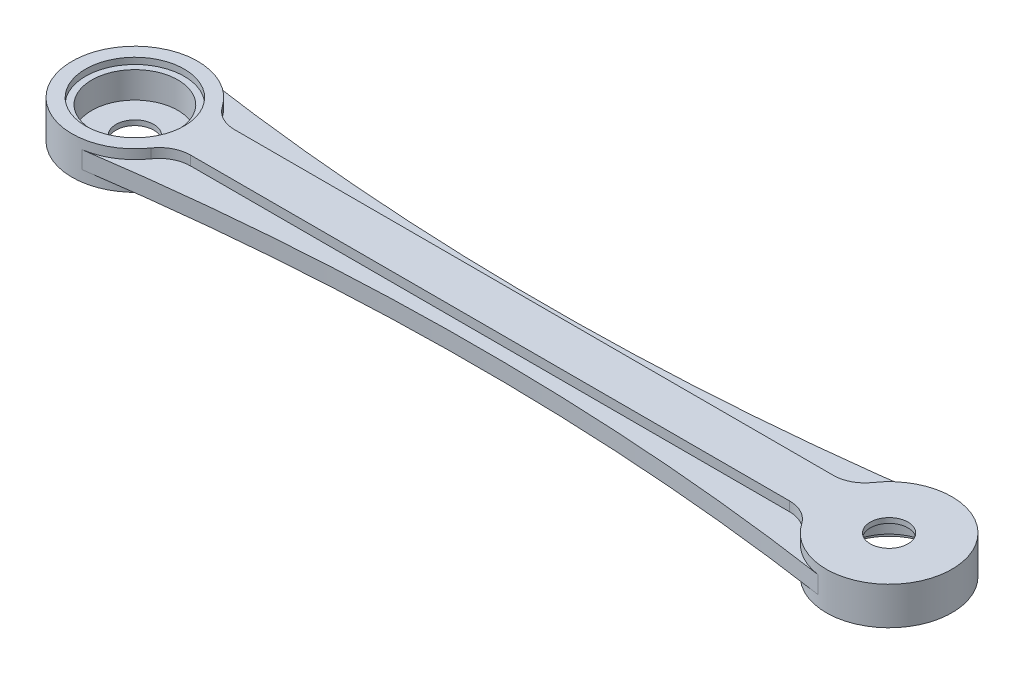
ISO-10303-21;
HEADER;
FILE_DESCRIPTION(('STEP AP214'),'2;1');
FILE_NAME('part.step','',(''),(''),'','','');
FILE_SCHEMA(('AUTOMOTIVE_DESIGN { 1 0 10303 214 1 1 1 1 }'));
ENDSEC;
DATA;
#1=APPLICATION_CONTEXT('core data for automotive mechanical design processes');
#2=APPLICATION_PROTOCOL_DEFINITION('international standard','automotive_design',2000,#1);
#3=PRODUCT_CONTEXT('',#1,'mechanical');
#4=PRODUCT('Part','Part','',(#3));
#5=PRODUCT_RELATED_PRODUCT_CATEGORY('part','',(#4));
#6=PRODUCT_DEFINITION_FORMATION('','',#4);
#7=PRODUCT_DEFINITION_CONTEXT('part definition',#1,'design');
#8=PRODUCT_DEFINITION('design','',#6,#7);
#9=PRODUCT_DEFINITION_SHAPE('','',#8);
#10=(LENGTH_UNIT() NAMED_UNIT(*) SI_UNIT(.MILLI.,.METRE.));
#11=(NAMED_UNIT(*) PLANE_ANGLE_UNIT() SI_UNIT($,.RADIAN.));
#12=(NAMED_UNIT(*) SI_UNIT($,.STERADIAN.) SOLID_ANGLE_UNIT());
#13=UNCERTAINTY_MEASURE_WITH_UNIT(LENGTH_MEASURE(1.E-05),#10,'distance_accuracy_value','');
#14=(GEOMETRIC_REPRESENTATION_CONTEXT(3) GLOBAL_UNCERTAINTY_ASSIGNED_CONTEXT((#13)) GLOBAL_UNIT_ASSIGNED_CONTEXT((#10,
#11,#12)) REPRESENTATION_CONTEXT('',''));
#15=CARTESIAN_POINT('',(0.,0.,0.));
#16=DIRECTION('',(0.,0.,1.));
#17=DIRECTION('',(1.,0.,0.));
#18=AXIS2_PLACEMENT_3D('',#15,#16,#17);
#19=CARTESIAN_POINT('',(-60.,6.,405.585995813465));
#20=DIRECTION('',(0.,-1.,0.));
#21=DIRECTION('',(0.,0.,-1.));
#22=AXIS2_PLACEMENT_3D('',#19,#20,#21);
#23=CYLINDRICAL_SURFACE('',#22,400.);
#24=CARTESIAN_POINT('',(-60.,1.75,405.585995813465));
#25=DIRECTION('',(0.,-1.,0.));
#26=DIRECTION('',(0.,0.,-1.));
#27=AXIS2_PLACEMENT_3D('',#24,#25,#26);
#28=CIRCLE('',#27,400.);
#29=CARTESIAN_POINT('',(-118.536585365854,1.75,9.89234136130402));
#30=VERTEX_POINT('',#29);
#31=CARTESIAN_POINT('',(-1.46341463414641,1.75,9.89234136130401));
#32=VERTEX_POINT('',#31);
#33=EDGE_CURVE('E189',#30,#32,#28,.T.);
#34=ORIENTED_EDGE('',*,*,#33,.T.);
#35=DIRECTION('',(0.,-1.,0.));
#36=VECTOR('',#35,1.);
#37=CARTESIAN_POINT('',(-1.46341463414634,6.,9.89234136130402));
#38=LINE('',#37,#36);
#39=CARTESIAN_POINT('',(-1.46341463414635,4.5,9.89234136130402));
#40=VERTEX_POINT('',#39);
#41=EDGE_CURVE('E49',#40,#32,#38,.T.);
#42=ORIENTED_EDGE('',*,*,#41,.F.);
#43=CARTESIAN_POINT('',(-60.,4.5,405.585995813465));
#44=DIRECTION('',(0.,1.,0.));
#45=DIRECTION('',(0.,0.,1.));
#46=AXIS2_PLACEMENT_3D('',#43,#44,#45);
#47=CIRCLE('',#46,400.);
#48=CARTESIAN_POINT('',(-118.536585365854,4.5,9.89234136130407));
#49=VERTEX_POINT('',#48);
#50=EDGE_CURVE('E204',#49,#40,#47,.F.);
#51=ORIENTED_EDGE('',*,*,#50,.F.);
#52=DIRECTION('',(0.,-1.,0.));
#53=VECTOR('',#52,1.);
#54=CARTESIAN_POINT('',(-118.536585365854,6.,9.89234136130402));
#55=LINE('',#54,#53);
#56=EDGE_CURVE('E11',#49,#30,#55,.T.);
#57=ORIENTED_EDGE('',*,*,#56,.T.);
#58=EDGE_LOOP('',(#34,#42,#51,#57));
#59=FACE_BOUND('',#58,.T.);
#60=ADVANCED_FACE('F39',(#59),#23,.F.);
#61=CARTESIAN_POINT('',(-60.,6.,-405.585995813465));
#62=DIRECTION('',(0.,-1.,0.));
#63=DIRECTION('',(0.,0.,-1.));
#64=AXIS2_PLACEMENT_3D('',#61,#62,#63);
#65=CYLINDRICAL_SURFACE('',#64,400.);
#66=DIRECTION('',(0.,-1.,0.));
#67=VECTOR('',#66,1.);
#68=CARTESIAN_POINT('',(-1.46341463414634,6.,-9.89234136130402));
#69=LINE('',#68,#67);
#70=CARTESIAN_POINT('',(-1.46341463414613,4.5,-9.89234136130407));
#71=VERTEX_POINT('',#70);
#72=CARTESIAN_POINT('',(-1.46341463414634,1.75,-9.89234136130402));
#73=VERTEX_POINT('',#72);
#74=EDGE_CURVE('E360',#71,#73,#69,.T.);
#75=ORIENTED_EDGE('',*,*,#74,.T.);
#76=CARTESIAN_POINT('',(-60.,1.75,-405.585995813465));
#77=DIRECTION('',(0.,-1.,0.));
#78=DIRECTION('',(0.,0.,-1.));
#79=AXIS2_PLACEMENT_3D('',#76,#77,#78);
#80=CIRCLE('',#79,400.);
#81=CARTESIAN_POINT('',(-118.536585365854,1.75,-9.89234136130404));
#82=VERTEX_POINT('',#81);
#83=EDGE_CURVE('E480',#73,#82,#80,.T.);
#84=ORIENTED_EDGE('',*,*,#83,.T.);
#85=DIRECTION('',(0.,-1.,0.));
#86=VECTOR('',#85,1.);
#87=CARTESIAN_POINT('',(-118.536585365854,6.,-9.89234136130402));
#88=LINE('',#87,#86);
#89=CARTESIAN_POINT('',(-118.536585365854,4.5,-9.89234136130407));
#90=VERTEX_POINT('',#89);
#91=EDGE_CURVE('E348',#90,#82,#88,.T.);
#92=ORIENTED_EDGE('',*,*,#91,.F.);
#93=CARTESIAN_POINT('',(-60.,4.5,-405.585995813465));
#94=DIRECTION('',(0.,1.,0.));
#95=DIRECTION('',(0.,0.,1.));
#96=AXIS2_PLACEMENT_3D('',#93,#94,#95);
#97=CIRCLE('',#96,400.);
#98=EDGE_CURVE('E418',#71,#90,#97,.F.);
#99=ORIENTED_EDGE('',*,*,#98,.F.);
#100=EDGE_LOOP('',(#75,#84,#92,#99));
#101=FACE_BOUND('',#100,.T.);
#102=ADVANCED_FACE('F400',(#101),#65,.F.);
#103=CARTESIAN_POINT('',(0.,6.,0.));
#104=DIRECTION('',(0.,1.,0.));
#105=DIRECTION('',(0.,0.,1.));
#106=AXIS2_PLACEMENT_3D('',#103,#104,#105);
#107=PLANE('',#106);
#108=CARTESIAN_POINT('',(-120.,6.,0.));
#109=DIRECTION('',(0.,1.,0.));
#110=DIRECTION('',(0.,0.,1.));
#111=AXIS2_PLACEMENT_3D('',#108,#109,#110);
#112=CIRCLE('',#111,7.84999999999999);
#113=CARTESIAN_POINT('',(-120.,6.,7.84999999999999));
#114=VERTEX_POINT('',#113);
#115=EDGE_CURVE('E335',#114,#114,#112,.T.);
#116=ORIENTED_EDGE('',*,*,#115,.F.);
#117=EDGE_LOOP('',(#116));
#118=FACE_BOUND('',#117,.T.);
#119=CARTESIAN_POINT('',(0.,6.,0.));
#120=DIRECTION('',(0.,1.,0.));
#121=DIRECTION('',(0.,0.,1.));
#122=AXIS2_PLACEMENT_3D('',#119,#120,#121);
#123=CIRCLE('',#122,3.);
#124=CARTESIAN_POINT('',(0.,6.,3.));
#125=VERTEX_POINT('',#124);
#126=EDGE_CURVE('E344',#125,#125,#123,.T.);
#127=ORIENTED_EDGE('',*,*,#126,.F.);
#128=EDGE_LOOP('',(#127));
#129=FACE_BOUND('',#128,.T.);
#130=CARTESIAN_POINT('',(-107.640792905692,6.,-8.5));
#131=DIRECTION('',(0.,1.,0.));
#132=DIRECTION('',(0.,0.,1.));
#133=AXIS2_PLACEMENT_3D('',#130,#131,#132);
#134=CIRCLE('',#133,5.);
#135=CARTESIAN_POINT('',(-111.760528603794,6.,-5.66666666666667));
#136=VERTEX_POINT('',#135);
#137=CARTESIAN_POINT('',(-107.640792905692,6.,-3.5));
#138=VERTEX_POINT('',#137);
#139=EDGE_CURVE('E244',#136,#138,#134,.T.);
#140=ORIENTED_EDGE('',*,*,#139,.F.);
#141=CARTESIAN_POINT('',(-120.,6.,0.));
#142=DIRECTION('',(0.,1.,0.));
#143=DIRECTION('',(0.,0.,1.));
#144=AXIS2_PLACEMENT_3D('',#141,#142,#143);
#145=CIRCLE('',#144,9.99999999999999);
#146=CARTESIAN_POINT('',(-111.760528603794,6.,5.66666666666667));
#147=VERTEX_POINT('',#146);
#148=EDGE_CURVE('E57',#136,#147,#145,.T.);
#149=ORIENTED_EDGE('',*,*,#148,.T.);
#150=CARTESIAN_POINT('',(-107.640792905692,6.,8.5));
#151=DIRECTION('',(0.,1.,0.));
#152=DIRECTION('',(0.,0.,1.));
#153=AXIS2_PLACEMENT_3D('',#150,#151,#152);
#154=CIRCLE('',#153,5.);
#155=CARTESIAN_POINT('',(-107.640792905692,6.,3.5));
#156=VERTEX_POINT('',#155);
#157=EDGE_CURVE('E215',#156,#147,#154,.T.);
#158=ORIENTED_EDGE('',*,*,#157,.F.);
#159=DIRECTION('',(1.,0.,0.));
#160=VECTOR('',#159,1.);
#161=CARTESIAN_POINT('',(0.,6.,3.5));
#162=LINE('',#161,#160);
#163=CARTESIAN_POINT('',(-12.3592070943083,6.,3.5));
#164=VERTEX_POINT('',#163);
#165=EDGE_CURVE('E234',#156,#164,#162,.T.);
#166=ORIENTED_EDGE('',*,*,#165,.T.);
#167=CARTESIAN_POINT('',(-12.3592070943083,6.,8.5));
#168=DIRECTION('',(0.,1.,0.));
#169=DIRECTION('',(0.,0.,1.));
#170=AXIS2_PLACEMENT_3D('',#167,#168,#169);
#171=CIRCLE('',#170,5.);
#172=CARTESIAN_POINT('',(-8.23947139620552,6.,5.66666666666666));
#173=VERTEX_POINT('',#172);
#174=EDGE_CURVE('E230',#173,#164,#171,.T.);
#175=ORIENTED_EDGE('',*,*,#174,.F.);
#176=CARTESIAN_POINT('',(0.,6.,0.));
#177=DIRECTION('',(0.,1.,0.));
#178=DIRECTION('',(0.,0.,1.));
#179=AXIS2_PLACEMENT_3D('',#176,#177,#178);
#180=CIRCLE('',#179,10.);
#181=CARTESIAN_POINT('',(-8.23947139620553,6.,-5.66666666666665));
#182=VERTEX_POINT('',#181);
#183=EDGE_CURVE('E341',#173,#182,#180,.T.);
#184=ORIENTED_EDGE('',*,*,#183,.T.);
#185=CARTESIAN_POINT('',(-12.3592070943083,6.,-8.49999999999999));
#186=DIRECTION('',(0.,1.,0.));
#187=DIRECTION('',(0.,0.,1.));
#188=AXIS2_PLACEMENT_3D('',#185,#186,#187);
#189=CIRCLE('',#188,5.);
#190=CARTESIAN_POINT('',(-12.3592070943083,6.,-3.49999999999998));
#191=VERTEX_POINT('',#190);
#192=EDGE_CURVE('E415',#191,#182,#189,.T.);
#193=ORIENTED_EDGE('',*,*,#192,.F.);
#194=DIRECTION('',(1.,0.,0.));
#195=VECTOR('',#194,1.);
#196=CARTESIAN_POINT('',(0.,6.,-3.49999999999998));
#197=LINE('',#196,#195);
#198=EDGE_CURVE('E410',#138,#191,#197,.T.);
#199=ORIENTED_EDGE('',*,*,#198,.F.);
#200=EDGE_LOOP('',(#140,#149,#158,#166,#175,#184,#193,#199));
#201=FACE_BOUND('',#200,.T.);
#202=ADVANCED_FACE('F396',(#118,#129,#201),#107,.T.);
#203=CARTESIAN_POINT('',(0.,0.,0.));
#204=DIRECTION('',(0.,1.,0.));
#205=DIRECTION('',(0.,0.,1.));
#206=AXIS2_PLACEMENT_3D('',#203,#204,#205);
#207=PLANE('',#206);
#208=CARTESIAN_POINT('',(0.,0.,0.));
#209=DIRECTION('',(0.,-1.,0.));
#210=DIRECTION('',(0.,0.,-1.));
#211=AXIS2_PLACEMENT_3D('',#208,#209,#210);
#212=CIRCLE('',#211,7.85);
#213=CARTESIAN_POINT('',(0.,0.,-7.85));
#214=VERTEX_POINT('',#213);
#215=EDGE_CURVE('E318',#214,#214,#212,.T.);
#216=ORIENTED_EDGE('',*,*,#215,.F.);
#217=EDGE_LOOP('',(#216));
#218=FACE_BOUND('',#217,.T.);
#219=CARTESIAN_POINT('',(-120.,0.,0.));
#220=DIRECTION('',(0.,1.,0.));
#221=DIRECTION('',(0.,0.,1.));
#222=AXIS2_PLACEMENT_3D('',#219,#220,#221);
#223=CIRCLE('',#222,3.00000000000001);
#224=CARTESIAN_POINT('',(-120.,0.,3.00000000000001));
#225=VERTEX_POINT('',#224);
#226=EDGE_CURVE('E334',#225,#225,#223,.T.);
#227=ORIENTED_EDGE('',*,*,#226,.T.);
#228=EDGE_LOOP('',(#227));
#229=FACE_BOUND('',#228,.T.);
#230=CARTESIAN_POINT('',(-107.640792905692,0.,8.5));
#231=DIRECTION('',(0.,-1.,0.));
#232=DIRECTION('',(0.,0.,-1.));
#233=AXIS2_PLACEMENT_3D('',#230,#231,#232);
#234=CIRCLE('',#233,5.);
#235=CARTESIAN_POINT('',(-107.640792905692,0.,3.5));
#236=VERTEX_POINT('',#235);
#237=CARTESIAN_POINT('',(-111.760528603794,0.,5.66666666666667));
#238=VERTEX_POINT('',#237);
#239=EDGE_CURVE('E257',#236,#238,#234,.F.);
#240=ORIENTED_EDGE('',*,*,#239,.T.);
#241=CARTESIAN_POINT('',(-120.,0.,0.));
#242=DIRECTION('',(0.,1.,0.));
#243=DIRECTION('',(0.,0.,1.));
#244=AXIS2_PLACEMENT_3D('',#241,#242,#243);
#245=CIRCLE('',#244,9.99999999999999);
#246=CARTESIAN_POINT('',(-111.760528603794,0.,-5.66666666666666));
#247=VERTEX_POINT('',#246);
#248=EDGE_CURVE('E352',#247,#238,#245,.T.);
#249=ORIENTED_EDGE('',*,*,#248,.F.);
#250=CARTESIAN_POINT('',(-107.640792905692,0.,-8.5));
#251=DIRECTION('',(0.,-1.,0.));
#252=DIRECTION('',(0.,0.,-1.));
#253=AXIS2_PLACEMENT_3D('',#250,#251,#252);
#254=CIRCLE('',#253,5.);
#255=CARTESIAN_POINT('',(-107.640792905692,0.,-3.5));
#256=VERTEX_POINT('',#255);
#257=EDGE_CURVE('E283',#256,#247,#254,.T.);
#258=ORIENTED_EDGE('',*,*,#257,.F.);
#259=DIRECTION('',(1.,0.,0.));
#260=VECTOR('',#259,1.);
#261=CARTESIAN_POINT('',(0.,0.,-3.49999999999998));
#262=LINE('',#261,#260);
#263=CARTESIAN_POINT('',(-12.3592070943083,0.,-3.49999999999999));
#264=VERTEX_POINT('',#263);
#265=EDGE_CURVE('E279',#256,#264,#262,.T.);
#266=ORIENTED_EDGE('',*,*,#265,.T.);
#267=CARTESIAN_POINT('',(-12.3592070943083,0.,-8.49999999999999));
#268=DIRECTION('',(0.,-1.,0.));
#269=DIRECTION('',(0.,0.,-1.));
#270=AXIS2_PLACEMENT_3D('',#267,#268,#269);
#271=CIRCLE('',#270,5.);
#272=CARTESIAN_POINT('',(-8.23947139620552,0.,-5.66666666666666));
#273=VERTEX_POINT('',#272);
#274=EDGE_CURVE('E288',#264,#273,#271,.F.);
#275=ORIENTED_EDGE('',*,*,#274,.T.);
#276=CARTESIAN_POINT('',(0.,0.,0.));
#277=DIRECTION('',(0.,1.,0.));
#278=DIRECTION('',(0.,0.,1.));
#279=AXIS2_PLACEMENT_3D('',#276,#277,#278);
#280=CIRCLE('',#279,10.);
#281=CARTESIAN_POINT('',(-8.23947139620551,0.,5.66666666666667));
#282=VERTEX_POINT('',#281);
#283=EDGE_CURVE('E65',#282,#273,#280,.T.);
#284=ORIENTED_EDGE('',*,*,#283,.F.);
#285=CARTESIAN_POINT('',(-12.3592070943083,0.,8.5));
#286=DIRECTION('',(0.,-1.,0.));
#287=DIRECTION('',(0.,0.,-1.));
#288=AXIS2_PLACEMENT_3D('',#285,#286,#287);
#289=CIRCLE('',#288,5.);
#290=CARTESIAN_POINT('',(-12.3592070943083,0.,3.5));
#291=VERTEX_POINT('',#290);
#292=EDGE_CURVE('E254',#282,#291,#289,.F.);
#293=ORIENTED_EDGE('',*,*,#292,.T.);
#294=DIRECTION('',(1.,0.,0.));
#295=VECTOR('',#294,1.);
#296=CARTESIAN_POINT('',(0.,0.,3.5));
#297=LINE('',#296,#295);
#298=EDGE_CURVE('E262',#236,#291,#297,.T.);
#299=ORIENTED_EDGE('',*,*,#298,.F.);
#300=EDGE_LOOP('',(#240,#249,#258,#266,#275,#284,#293,#299));
#301=FACE_BOUND('',#300,.T.);
#302=ADVANCED_FACE('F399',(#218,#229,#301),#207,.F.);
#303=CARTESIAN_POINT('',(0.,6.,0.));
#304=DIRECTION('',(0.,-1.,0.));
#305=DIRECTION('',(0.,0.,-1.));
#306=AXIS2_PLACEMENT_3D('',#303,#304,#305);
#307=CYLINDRICAL_SURFACE('',#306,3.);
#308=ORIENTED_EDGE('',*,*,#126,.T.);
#309=EDGE_LOOP('',(#308));
#310=FACE_BOUND('',#309,.T.);
#311=CARTESIAN_POINT('',(0.,5.2,0.));
#312=DIRECTION('',(0.,-1.,0.));
#313=DIRECTION('',(0.,0.,-1.));
#314=AXIS2_PLACEMENT_3D('',#311,#312,#313);
#315=CIRCLE('',#314,3.);
#316=CARTESIAN_POINT('',(0.,5.2,-3.));
#317=VERTEX_POINT('',#316);
#318=EDGE_CURVE('E43',#317,#317,#315,.T.);
#319=ORIENTED_EDGE('',*,*,#318,.T.);
#320=EDGE_LOOP('',(#319));
#321=FACE_BOUND('',#320,.T.);
#322=ADVANCED_FACE('F563',(#310,#321),#307,.F.);
#323=CARTESIAN_POINT('',(-120.,6.,0.));
#324=DIRECTION('',(0.,-1.,0.));
#325=DIRECTION('',(0.,0.,-1.));
#326=AXIS2_PLACEMENT_3D('',#323,#324,#325);
#327=CYLINDRICAL_SURFACE('',#326,3.00000000000001);
#328=ORIENTED_EDGE('',*,*,#226,.F.);
#329=EDGE_LOOP('',(#328));
#330=FACE_BOUND('',#329,.T.);
#331=CARTESIAN_POINT('',(-120.,0.799999999999999,0.));
#332=DIRECTION('',(0.,1.,0.));
#333=DIRECTION('',(0.,0.,1.));
#334=AXIS2_PLACEMENT_3D('',#331,#332,#333);
#335=CIRCLE('',#334,3.00000000000001);
#336=CARTESIAN_POINT('',(-120.,0.799999999999999,3.00000000000001));
#337=VERTEX_POINT('',#336);
#338=EDGE_CURVE('E326',#337,#337,#335,.T.);
#339=ORIENTED_EDGE('',*,*,#338,.T.);
#340=EDGE_LOOP('',(#339));
#341=FACE_BOUND('',#340,.T.);
#342=ADVANCED_FACE('F41',(#330,#341),#327,.F.);
#343=CARTESIAN_POINT('',(-120.,6.,0.));
#344=DIRECTION('',(0.,-1.,0.));
#345=DIRECTION('',(0.,0.,-1.));
#346=AXIS2_PLACEMENT_3D('',#343,#344,#345);
#347=CYLINDRICAL_SURFACE('',#346,9.99999999999999);
#348=DIRECTION('',(0.,-1.,0.));
#349=VECTOR('',#348,1.);
#350=CARTESIAN_POINT('',(-111.760528603794,1.5,5.66666666666667));
#351=LINE('',#350,#349);
#352=CARTESIAN_POINT('',(-111.760528603794,1.75,5.66666666666666));
#353=VERTEX_POINT('',#352);
#354=EDGE_CURVE('E183',#353,#238,#351,.T.);
#355=ORIENTED_EDGE('',*,*,#354,.F.);
#356=CARTESIAN_POINT('',(-120.,1.75,0.));
#357=DIRECTION('',(0.,-1.,0.));
#358=DIRECTION('',(0.,0.,-1.));
#359=AXIS2_PLACEMENT_3D('',#356,#357,#358);
#360=CIRCLE('',#359,9.99999999999999);
#361=EDGE_CURVE('E179',#353,#30,#360,.T.);
#362=ORIENTED_EDGE('',*,*,#361,.T.);
#363=ORIENTED_EDGE('',*,*,#56,.F.);
#364=CARTESIAN_POINT('',(-120.,4.5,0.));
#365=DIRECTION('',(0.,1.,0.));
#366=DIRECTION('',(0.,0.,1.));
#367=AXIS2_PLACEMENT_3D('',#364,#365,#366);
#368=CIRCLE('',#367,9.99999999999999);
#369=CARTESIAN_POINT('',(-111.760528603794,4.5,5.66666666666667));
#370=VERTEX_POINT('',#369);
#371=EDGE_CURVE('E209',#49,#370,#368,.T.);
#372=ORIENTED_EDGE('',*,*,#371,.T.);
#373=DIRECTION('',(0.,1.,0.));
#374=VECTOR('',#373,1.);
#375=CARTESIAN_POINT('',(-111.760528603794,4.5,5.66666666666667));
#376=LINE('',#375,#374);
#377=EDGE_CURVE('E241',#370,#147,#376,.T.);
#378=ORIENTED_EDGE('',*,*,#377,.T.);
#379=ORIENTED_EDGE('',*,*,#148,.F.);
#380=DIRECTION('',(0.,1.,0.));
#381=VECTOR('',#380,1.);
#382=CARTESIAN_POINT('',(-111.760528603794,4.5,-5.66666666666667));
#383=LINE('',#382,#381);
#384=CARTESIAN_POINT('',(-111.760528603794,4.5,-5.66666666666667));
#385=VERTEX_POINT('',#384);
#386=EDGE_CURVE('E433',#385,#136,#383,.T.);
#387=ORIENTED_EDGE('',*,*,#386,.F.);
#388=CARTESIAN_POINT('',(-120.,4.5,0.));
#389=DIRECTION('',(0.,1.,0.));
#390=DIRECTION('',(0.,0.,1.));
#391=AXIS2_PLACEMENT_3D('',#388,#389,#390);
#392=CIRCLE('',#391,9.99999999999999);
#393=EDGE_CURVE('E424',#385,#90,#392,.T.);
#394=ORIENTED_EDGE('',*,*,#393,.T.);
#395=ORIENTED_EDGE('',*,*,#91,.T.);
#396=CARTESIAN_POINT('',(-120.,1.75,0.));
#397=DIRECTION('',(0.,-1.,0.));
#398=DIRECTION('',(0.,0.,-1.));
#399=AXIS2_PLACEMENT_3D('',#396,#397,#398);
#400=CIRCLE('',#399,9.99999999999999);
#401=CARTESIAN_POINT('',(-111.760528603794,1.75,-5.66666666666666));
#402=VERTEX_POINT('',#401);
#403=EDGE_CURVE('E200',#82,#402,#400,.T.);
#404=ORIENTED_EDGE('',*,*,#403,.T.);
#405=DIRECTION('',(0.,-1.,0.));
#406=VECTOR('',#405,1.);
#407=CARTESIAN_POINT('',(-111.760528603794,1.5,-5.66666666666666));
#408=LINE('',#407,#406);
#409=EDGE_CURVE('E299',#402,#247,#408,.T.);
#410=ORIENTED_EDGE('',*,*,#409,.T.);
#411=ORIENTED_EDGE('',*,*,#248,.T.);
#412=EDGE_LOOP('',(#355,#362,#363,#372,#378,#379,#387,#394,#395,#404,#410,#411));
#413=FACE_BOUND('',#412,.T.);
#414=ADVANCED_FACE('F181',(#413),#347,.T.);
#415=CARTESIAN_POINT('',(0.,6.,0.));
#416=DIRECTION('',(0.,-1.,0.));
#417=DIRECTION('',(0.,0.,-1.));
#418=AXIS2_PLACEMENT_3D('',#415,#416,#417);
#419=CYLINDRICAL_SURFACE('',#418,10.);
#420=DIRECTION('',(0.,-1.,0.));
#421=VECTOR('',#420,1.);
#422=CARTESIAN_POINT('',(-8.23947139620552,1.5,-5.66666666666666));
#423=LINE('',#422,#421);
#424=CARTESIAN_POINT('',(-8.23947139620552,1.75,-5.66666666666666));
#425=VERTEX_POINT('',#424);
#426=EDGE_CURVE('E295',#425,#273,#423,.T.);
#427=ORIENTED_EDGE('',*,*,#426,.F.);
#428=CARTESIAN_POINT('',(0.,1.75,0.));
#429=DIRECTION('',(0.,-1.,0.));
#430=DIRECTION('',(0.,0.,-1.));
#431=AXIS2_PLACEMENT_3D('',#428,#429,#430);
#432=CIRCLE('',#431,10.);
#433=EDGE_CURVE('E477',#425,#73,#432,.T.);
#434=ORIENTED_EDGE('',*,*,#433,.T.);
#435=ORIENTED_EDGE('',*,*,#74,.F.);
#436=CARTESIAN_POINT('',(0.,4.5,0.));
#437=DIRECTION('',(0.,1.,0.));
#438=DIRECTION('',(0.,0.,1.));
#439=AXIS2_PLACEMENT_3D('',#436,#437,#438);
#440=CIRCLE('',#439,10.);
#441=CARTESIAN_POINT('',(-8.23947139620553,4.5,-5.66666666666665));
#442=VERTEX_POINT('',#441);
#443=EDGE_CURVE('E438',#71,#442,#440,.T.);
#444=ORIENTED_EDGE('',*,*,#443,.T.);
#445=DIRECTION('',(0.,1.,0.));
#446=VECTOR('',#445,1.);
#447=CARTESIAN_POINT('',(-8.23947139620553,4.5,-5.66666666666665));
#448=LINE('',#447,#446);
#449=EDGE_CURVE('E284',#442,#182,#448,.T.);
#450=ORIENTED_EDGE('',*,*,#449,.T.);
#451=ORIENTED_EDGE('',*,*,#183,.F.);
#452=DIRECTION('',(0.,1.,0.));
#453=VECTOR('',#452,1.);
#454=CARTESIAN_POINT('',(-8.23947139620552,4.5,5.66666666666666));
#455=LINE('',#454,#453);
#456=CARTESIAN_POINT('',(-8.23947139620552,4.5,5.66666666666666));
#457=VERTEX_POINT('',#456);
#458=EDGE_CURVE('E229',#457,#173,#455,.T.);
#459=ORIENTED_EDGE('',*,*,#458,.F.);
#460=CARTESIAN_POINT('',(0.,4.5,0.));
#461=DIRECTION('',(0.,1.,0.));
#462=DIRECTION('',(0.,0.,1.));
#463=AXIS2_PLACEMENT_3D('',#460,#461,#462);
#464=CIRCLE('',#463,10.);
#465=EDGE_CURVE('E208',#457,#40,#464,.T.);
#466=ORIENTED_EDGE('',*,*,#465,.T.);
#467=ORIENTED_EDGE('',*,*,#41,.T.);
#468=CARTESIAN_POINT('',(0.,1.75,0.));
#469=DIRECTION('',(0.,-1.,0.));
#470=DIRECTION('',(0.,0.,-1.));
#471=AXIS2_PLACEMENT_3D('',#468,#469,#470);
#472=CIRCLE('',#471,10.);
#473=CARTESIAN_POINT('',(-8.23947139620551,1.75,5.66666666666667));
#474=VERTEX_POINT('',#473);
#475=EDGE_CURVE('E195',#32,#474,#472,.T.);
#476=ORIENTED_EDGE('',*,*,#475,.T.);
#477=DIRECTION('',(0.,-1.,0.));
#478=VECTOR('',#477,1.);
#479=CARTESIAN_POINT('',(-8.23947139620551,1.5,5.66666666666667));
#480=LINE('',#479,#478);
#481=EDGE_CURVE('E266',#474,#282,#480,.T.);
#482=ORIENTED_EDGE('',*,*,#481,.T.);
#483=ORIENTED_EDGE('',*,*,#283,.T.);
#484=EDGE_LOOP('',(#427,#434,#435,#444,#450,#451,#459,#466,#467,#476,#482,#483));
#485=FACE_BOUND('',#484,.T.);
#486=ADVANCED_FACE('F392',(#485),#419,.T.);
#487=CARTESIAN_POINT('',(-120.,5.,0.));
#488=DIRECTION('',(0.,1.,0.));
#489=DIRECTION('',(0.,0.,1.));
#490=AXIS2_PLACEMENT_3D('',#487,#488,#489);
#491=CYLINDRICAL_SURFACE('',#490,7.84999999999999);
#492=CARTESIAN_POINT('',(-120.,5.,0.));
#493=DIRECTION('',(0.,1.,0.));
#494=DIRECTION('',(0.,0.,1.));
#495=AXIS2_PLACEMENT_3D('',#492,#493,#494);
#496=CIRCLE('',#495,7.84999999999999);
#497=CARTESIAN_POINT('',(-120.,5.,7.84999999999999));
#498=VERTEX_POINT('',#497);
#499=EDGE_CURVE('E330',#498,#498,#496,.T.);
#500=ORIENTED_EDGE('',*,*,#499,.F.);
#501=EDGE_LOOP('',(#500));
#502=FACE_BOUND('',#501,.T.);
#503=ORIENTED_EDGE('',*,*,#115,.T.);
#504=EDGE_LOOP('',(#503));
#505=FACE_BOUND('',#504,.T.);
#506=ADVANCED_FACE('F386',(#502,#505),#491,.F.);
#507=CARTESIAN_POINT('',(-120.,5.,0.));
#508=DIRECTION('',(0.,1.,0.));
#509=DIRECTION('',(0.,0.,1.));
#510=AXIS2_PLACEMENT_3D('',#507,#508,#509);
#511=PLANE('',#510);
#512=CARTESIAN_POINT('',(-120.,5.,0.));
#513=DIRECTION('',(0.,1.,0.));
#514=DIRECTION('',(0.,0.,1.));
#515=AXIS2_PLACEMENT_3D('',#512,#513,#514);
#516=CIRCLE('',#515,6.85);
#517=CARTESIAN_POINT('',(-120.,5.,6.85));
#518=VERTEX_POINT('',#517);
#519=EDGE_CURVE('E317',#518,#518,#516,.T.);
#520=ORIENTED_EDGE('',*,*,#519,.F.);
#521=EDGE_LOOP('',(#520));
#522=FACE_BOUND('',#521,.T.);
#523=ORIENTED_EDGE('',*,*,#499,.T.);
#524=EDGE_LOOP('',(#523));
#525=FACE_BOUND('',#524,.T.);
#526=ADVANCED_FACE('F380',(#522,#525),#511,.T.);
#527=CARTESIAN_POINT('',(-120.,0.799999999999999,0.));
#528=DIRECTION('',(0.,1.,0.));
#529=DIRECTION('',(0.,0.,1.));
#530=AXIS2_PLACEMENT_3D('',#527,#528,#529);
#531=CYLINDRICAL_SURFACE('',#530,6.85);
#532=CARTESIAN_POINT('',(-120.,0.799999999999999,0.));
#533=DIRECTION('',(0.,1.,0.));
#534=DIRECTION('',(0.,0.,1.));
#535=AXIS2_PLACEMENT_3D('',#532,#533,#534);
#536=CIRCLE('',#535,6.85);
#537=CARTESIAN_POINT('',(-120.,0.799999999999999,6.85));
#538=VERTEX_POINT('',#537);
#539=EDGE_CURVE('E322',#538,#538,#536,.T.);
#540=ORIENTED_EDGE('',*,*,#539,.F.);
#541=EDGE_LOOP('',(#540));
#542=FACE_BOUND('',#541,.T.);
#543=ORIENTED_EDGE('',*,*,#519,.T.);
#544=EDGE_LOOP('',(#543));
#545=FACE_BOUND('',#544,.T.);
#546=ADVANCED_FACE('F374',(#542,#545),#531,.F.);
#547=CARTESIAN_POINT('',(-120.,0.799999999999999,0.));
#548=DIRECTION('',(0.,1.,0.));
#549=DIRECTION('',(0.,0.,1.));
#550=AXIS2_PLACEMENT_3D('',#547,#548,#549);
#551=PLANE('',#550);
#552=ORIENTED_EDGE('',*,*,#338,.F.);
#553=EDGE_LOOP('',(#552));
#554=FACE_BOUND('',#553,.T.);
#555=ORIENTED_EDGE('',*,*,#539,.T.);
#556=EDGE_LOOP('',(#555));
#557=FACE_BOUND('',#556,.T.);
#558=ADVANCED_FACE('F370',(#554,#557),#551,.T.);
#559=CARTESIAN_POINT('',(0.,1.,0.));
#560=DIRECTION('',(0.,-1.,0.));
#561=DIRECTION('',(0.,0.,-1.));
#562=AXIS2_PLACEMENT_3D('',#559,#560,#561);
#563=CYLINDRICAL_SURFACE('',#562,7.85);
#564=CARTESIAN_POINT('',(0.,1.,0.));
#565=DIRECTION('',(0.,-1.,0.));
#566=DIRECTION('',(0.,0.,-1.));
#567=AXIS2_PLACEMENT_3D('',#564,#565,#566);
#568=CIRCLE('',#567,7.85);
#569=CARTESIAN_POINT('',(0.,1.,-7.85));
#570=VERTEX_POINT('',#569);
#571=EDGE_CURVE('E313',#570,#570,#568,.T.);
#572=ORIENTED_EDGE('',*,*,#571,.F.);
#573=EDGE_LOOP('',(#572));
#574=FACE_BOUND('',#573,.T.);
#575=ORIENTED_EDGE('',*,*,#215,.T.);
#576=EDGE_LOOP('',(#575));
#577=FACE_BOUND('',#576,.T.);
#578=ADVANCED_FACE('F373',(#574,#577),#563,.F.);
#579=CARTESIAN_POINT('',(0.,1.,0.));
#580=DIRECTION('',(0.,-1.,0.));
#581=DIRECTION('',(0.,0.,-1.));
#582=AXIS2_PLACEMENT_3D('',#579,#580,#581);
#583=PLANE('',#582);
#584=CARTESIAN_POINT('',(0.,1.,0.));
#585=DIRECTION('',(0.,-1.,0.));
#586=DIRECTION('',(0.,0.,-1.));
#587=AXIS2_PLACEMENT_3D('',#584,#585,#586);
#588=CIRCLE('',#587,6.85);
#589=CARTESIAN_POINT('',(0.,1.,-6.85));
#590=VERTEX_POINT('',#589);
#591=EDGE_CURVE('E270',#590,#590,#588,.T.);
#592=ORIENTED_EDGE('',*,*,#591,.F.);
#593=EDGE_LOOP('',(#592));
#594=FACE_BOUND('',#593,.T.);
#595=ORIENTED_EDGE('',*,*,#571,.T.);
#596=EDGE_LOOP('',(#595));
#597=FACE_BOUND('',#596,.T.);
#598=ADVANCED_FACE('F581',(#594,#597),#583,.T.);
#599=CARTESIAN_POINT('',(0.,5.2,0.));
#600=DIRECTION('',(0.,-1.,0.));
#601=DIRECTION('',(0.,0.,-1.));
#602=AXIS2_PLACEMENT_3D('',#599,#600,#601);
#603=CYLINDRICAL_SURFACE('',#602,6.85);
#604=CARTESIAN_POINT('',(0.,5.2,0.));
#605=DIRECTION('',(0.,-1.,0.));
#606=DIRECTION('',(0.,0.,-1.));
#607=AXIS2_PLACEMENT_3D('',#604,#605,#606);
#608=CIRCLE('',#607,6.85);
#609=CARTESIAN_POINT('',(0.,5.2,-6.85));
#610=VERTEX_POINT('',#609);
#611=EDGE_CURVE('E306',#610,#610,#608,.T.);
#612=ORIENTED_EDGE('',*,*,#611,.F.);
#613=EDGE_LOOP('',(#612));
#614=FACE_BOUND('',#613,.T.);
#615=ORIENTED_EDGE('',*,*,#591,.T.);
#616=EDGE_LOOP('',(#615));
#617=FACE_BOUND('',#616,.T.);
#618=ADVANCED_FACE('F585',(#614,#617),#603,.F.);
#619=CARTESIAN_POINT('',(0.,5.2,0.));
#620=DIRECTION('',(0.,-1.,0.));
#621=DIRECTION('',(0.,0.,-1.));
#622=AXIS2_PLACEMENT_3D('',#619,#620,#621);
#623=PLANE('',#622);
#624=ORIENTED_EDGE('',*,*,#318,.F.);
#625=EDGE_LOOP('',(#624));
#626=FACE_BOUND('',#625,.T.);
#627=ORIENTED_EDGE('',*,*,#611,.T.);
#628=EDGE_LOOP('',(#627));
#629=FACE_BOUND('',#628,.T.);
#630=ADVANCED_FACE('F548',(#626,#629),#623,.T.);
#631=CARTESIAN_POINT('',(0.,1.5,-3.49999999999998));
#632=DIRECTION('',(0.,0.,-1.));
#633=DIRECTION('',(-1.,0.,0.));
#634=AXIS2_PLACEMENT_3D('',#631,#632,#633);
#635=PLANE('',#634);
#636=ORIENTED_EDGE('',*,*,#265,.F.);
#637=DIRECTION('',(0.,-1.,0.));
#638=VECTOR('',#637,1.);
#639=CARTESIAN_POINT('',(-107.640792905692,1.5,-3.5));
#640=LINE('',#639,#638);
#641=CARTESIAN_POINT('',(-107.640792905692,1.75,-3.5));
#642=VERTEX_POINT('',#641);
#643=EDGE_CURVE('E291',#642,#256,#640,.T.);
#644=ORIENTED_EDGE('',*,*,#643,.F.);
#645=DIRECTION('',(1.,0.,0.));
#646=VECTOR('',#645,1.);
#647=CARTESIAN_POINT('',(0.,1.75,-3.49999999999998));
#648=LINE('',#647,#646);
#649=CARTESIAN_POINT('',(-12.3592070943083,1.75,-3.49999999999998));
#650=VERTEX_POINT('',#649);
#651=EDGE_CURVE('E469',#642,#650,#648,.T.);
#652=ORIENTED_EDGE('',*,*,#651,.T.);
#653=DIRECTION('',(0.,-1.,0.));
#654=VECTOR('',#653,1.);
#655=CARTESIAN_POINT('',(-12.3592070943083,1.5,-3.49999999999999));
#656=LINE('',#655,#654);
#657=EDGE_CURVE('E258',#650,#264,#656,.T.);
#658=ORIENTED_EDGE('',*,*,#657,.T.);
#659=EDGE_LOOP('',(#636,#644,#652,#658));
#660=FACE_BOUND('',#659,.T.);
#661=ADVANCED_FACE('F538',(#660),#635,.T.);
#662=CARTESIAN_POINT('',(-12.3592070943083,1.5,-8.49999999999999));
#663=DIRECTION('',(0.,-1.,0.));
#664=DIRECTION('',(0.,0.,-1.));
#665=AXIS2_PLACEMENT_3D('',#662,#663,#664);
#666=CYLINDRICAL_SURFACE('',#665,5.);
#667=ORIENTED_EDGE('',*,*,#274,.F.);
#668=ORIENTED_EDGE('',*,*,#657,.F.);
#669=CARTESIAN_POINT('',(-12.3592070943083,1.75,-8.49999999999999));
#670=DIRECTION('',(0.,-1.,0.));
#671=DIRECTION('',(0.,0.,-1.));
#672=AXIS2_PLACEMENT_3D('',#669,#670,#671);
#673=CIRCLE('',#672,5.);
#674=EDGE_CURVE('E473',#650,#425,#673,.F.);
#675=ORIENTED_EDGE('',*,*,#674,.T.);
#676=ORIENTED_EDGE('',*,*,#426,.T.);
#677=EDGE_LOOP('',(#667,#668,#675,#676));
#678=FACE_BOUND('',#677,.T.);
#679=ADVANCED_FACE('F540',(#678),#666,.F.);
#680=CARTESIAN_POINT('',(-107.640792905692,1.5,-8.5));
#681=DIRECTION('',(0.,-1.,0.));
#682=DIRECTION('',(0.,0.,-1.));
#683=AXIS2_PLACEMENT_3D('',#680,#681,#682);
#684=CYLINDRICAL_SURFACE('',#683,5.);
#685=ORIENTED_EDGE('',*,*,#257,.T.);
#686=ORIENTED_EDGE('',*,*,#409,.F.);
#687=CARTESIAN_POINT('',(-107.640792905692,1.75,-8.5));
#688=DIRECTION('',(0.,-1.,0.));
#689=DIRECTION('',(0.,0.,-1.));
#690=AXIS2_PLACEMENT_3D('',#687,#688,#689);
#691=CIRCLE('',#690,5.);
#692=EDGE_CURVE('E465',#402,#642,#691,.F.);
#693=ORIENTED_EDGE('',*,*,#692,.T.);
#694=ORIENTED_EDGE('',*,*,#643,.T.);
#695=EDGE_LOOP('',(#685,#686,#693,#694));
#696=FACE_BOUND('',#695,.T.);
#697=ADVANCED_FACE('F535',(#696),#684,.F.);
#698=CARTESIAN_POINT('',(-12.3592070943083,1.5,8.5));
#699=DIRECTION('',(0.,-1.,0.));
#700=DIRECTION('',(0.,0.,-1.));
#701=AXIS2_PLACEMENT_3D('',#698,#699,#700);
#702=CYLINDRICAL_SURFACE('',#701,5.);
#703=ORIENTED_EDGE('',*,*,#292,.F.);
#704=ORIENTED_EDGE('',*,*,#481,.F.);
#705=CARTESIAN_POINT('',(-12.3592070943083,1.75,8.5));
#706=DIRECTION('',(0.,-1.,0.));
#707=DIRECTION('',(0.,0.,-1.));
#708=AXIS2_PLACEMENT_3D('',#705,#706,#707);
#709=CIRCLE('',#708,5.);
#710=CARTESIAN_POINT('',(-12.3592070943083,1.75,3.5));
#711=VERTEX_POINT('',#710);
#712=EDGE_CURVE('E486',#474,#711,#709,.F.);
#713=ORIENTED_EDGE('',*,*,#712,.T.);
#714=DIRECTION('',(0.,-1.,0.));
#715=VECTOR('',#714,1.);
#716=CARTESIAN_POINT('',(-12.3592070943083,1.5,3.5));
#717=LINE('',#716,#715);
#718=EDGE_CURVE('E267',#711,#291,#717,.T.);
#719=ORIENTED_EDGE('',*,*,#718,.T.);
#720=EDGE_LOOP('',(#703,#704,#713,#719));
#721=FACE_BOUND('',#720,.T.);
#722=ADVANCED_FACE('F503',(#721),#702,.F.);
#723=CARTESIAN_POINT('',(0.,1.5,3.5));
#724=DIRECTION('',(0.,0.,-1.));
#725=DIRECTION('',(-1.,0.,0.));
#726=AXIS2_PLACEMENT_3D('',#723,#724,#725);
#727=PLANE('',#726);
#728=ORIENTED_EDGE('',*,*,#298,.T.);
#729=ORIENTED_EDGE('',*,*,#718,.F.);
#730=DIRECTION('',(-1.,0.,0.));
#731=VECTOR('',#730,1.);
#732=CARTESIAN_POINT('',(0.,1.75,3.5));
#733=LINE('',#732,#731);
#734=CARTESIAN_POINT('',(-107.640792905692,1.75,3.5));
#735=VERTEX_POINT('',#734);
#736=EDGE_CURVE('E490',#711,#735,#733,.T.);
#737=ORIENTED_EDGE('',*,*,#736,.T.);
#738=DIRECTION('',(0.,-1.,0.));
#739=VECTOR('',#738,1.);
#740=CARTESIAN_POINT('',(-107.640792905692,1.5,3.5));
#741=LINE('',#740,#739);
#742=EDGE_CURVE('E271',#735,#236,#741,.T.);
#743=ORIENTED_EDGE('',*,*,#742,.T.);
#744=EDGE_LOOP('',(#728,#729,#737,#743));
#745=FACE_BOUND('',#744,.T.);
#746=ADVANCED_FACE('F500',(#745),#727,.F.);
#747=CARTESIAN_POINT('',(-107.640792905692,1.5,8.5));
#748=DIRECTION('',(0.,-1.,0.));
#749=DIRECTION('',(0.,0.,-1.));
#750=AXIS2_PLACEMENT_3D('',#747,#748,#749);
#751=CYLINDRICAL_SURFACE('',#750,5.);
#752=ORIENTED_EDGE('',*,*,#239,.F.);
#753=ORIENTED_EDGE('',*,*,#742,.F.);
#754=CARTESIAN_POINT('',(-107.640792905692,1.75,8.5));
#755=DIRECTION('',(0.,-1.,0.));
#756=DIRECTION('',(0.,0.,-1.));
#757=AXIS2_PLACEMENT_3D('',#754,#755,#756);
#758=CIRCLE('',#757,5.);
#759=EDGE_CURVE('E188',#735,#353,#758,.F.);
#760=ORIENTED_EDGE('',*,*,#759,.T.);
#761=ORIENTED_EDGE('',*,*,#354,.T.);
#762=EDGE_LOOP('',(#752,#753,#760,#761));
#763=FACE_BOUND('',#762,.T.);
#764=ADVANCED_FACE('F497',(#763),#751,.F.);
#765=CARTESIAN_POINT('',(-107.640792905692,4.5,8.5));
#766=DIRECTION('',(0.,1.,0.));
#767=DIRECTION('',(0.,0.,1.));
#768=AXIS2_PLACEMENT_3D('',#765,#766,#767);
#769=CYLINDRICAL_SURFACE('',#768,5.);
#770=ORIENTED_EDGE('',*,*,#157,.T.);
#771=ORIENTED_EDGE('',*,*,#377,.F.);
#772=CARTESIAN_POINT('',(-107.640792905692,4.5,8.5));
#773=DIRECTION('',(0.,1.,0.));
#774=DIRECTION('',(0.,0.,1.));
#775=AXIS2_PLACEMENT_3D('',#772,#773,#774);
#776=CIRCLE('',#775,5.);
#777=CARTESIAN_POINT('',(-107.640792905692,4.5,3.5));
#778=VERTEX_POINT('',#777);
#779=EDGE_CURVE('E225',#778,#370,#776,.T.);
#780=ORIENTED_EDGE('',*,*,#779,.F.);
#781=DIRECTION('',(0.,1.,0.));
#782=VECTOR('',#781,1.);
#783=CARTESIAN_POINT('',(-107.640792905692,4.5,3.5));
#784=LINE('',#783,#782);
#785=EDGE_CURVE('E245',#778,#156,#784,.T.);
#786=ORIENTED_EDGE('',*,*,#785,.T.);
#787=EDGE_LOOP('',(#770,#771,#780,#786));
#788=FACE_BOUND('',#787,.T.);
#789=ADVANCED_FACE('F517',(#788),#769,.F.);
#790=CARTESIAN_POINT('',(0.,4.5,3.5));
#791=DIRECTION('',(0.,0.,1.));
#792=DIRECTION('',(1.,0.,0.));
#793=AXIS2_PLACEMENT_3D('',#790,#791,#792);
#794=PLANE('',#793);
#795=ORIENTED_EDGE('',*,*,#165,.F.);
#796=ORIENTED_EDGE('',*,*,#785,.F.);
#797=DIRECTION('',(1.,0.,0.));
#798=VECTOR('',#797,1.);
#799=CARTESIAN_POINT('',(0.,4.5,3.5));
#800=LINE('',#799,#798);
#801=CARTESIAN_POINT('',(-12.3592070943083,4.5,3.5));
#802=VERTEX_POINT('',#801);
#803=EDGE_CURVE('E222',#778,#802,#800,.T.);
#804=ORIENTED_EDGE('',*,*,#803,.T.);
#805=DIRECTION('',(0.,1.,0.));
#806=VECTOR('',#805,1.);
#807=CARTESIAN_POINT('',(-12.3592070943083,4.5,3.5));
#808=LINE('',#807,#806);
#809=EDGE_CURVE('E248',#802,#164,#808,.T.);
#810=ORIENTED_EDGE('',*,*,#809,.T.);
#811=EDGE_LOOP('',(#795,#796,#804,#810));
#812=FACE_BOUND('',#811,.T.);
#813=ADVANCED_FACE('F513',(#812),#794,.T.);
#814=CARTESIAN_POINT('',(-12.3592070943083,4.5,8.5));
#815=DIRECTION('',(0.,1.,0.));
#816=DIRECTION('',(0.,0.,1.));
#817=AXIS2_PLACEMENT_3D('',#814,#815,#816);
#818=CYLINDRICAL_SURFACE('',#817,5.);
#819=ORIENTED_EDGE('',*,*,#174,.T.);
#820=ORIENTED_EDGE('',*,*,#809,.F.);
#821=CARTESIAN_POINT('',(-12.3592070943083,4.5,8.5));
#822=DIRECTION('',(0.,1.,0.));
#823=DIRECTION('',(0.,0.,1.));
#824=AXIS2_PLACEMENT_3D('',#821,#822,#823);
#825=CIRCLE('',#824,5.);
#826=EDGE_CURVE('E213',#457,#802,#825,.T.);
#827=ORIENTED_EDGE('',*,*,#826,.F.);
#828=ORIENTED_EDGE('',*,*,#458,.T.);
#829=EDGE_LOOP('',(#819,#820,#827,#828));
#830=FACE_BOUND('',#829,.T.);
#831=ADVANCED_FACE('F509',(#830),#818,.F.);
#832=CARTESIAN_POINT('',(0.,4.5,0.));
#833=DIRECTION('',(0.,1.,0.));
#834=DIRECTION('',(0.,0.,1.));
#835=AXIS2_PLACEMENT_3D('',#832,#833,#834);
#836=PLANE('',#835);
#837=ORIENTED_EDGE('',*,*,#371,.F.);
#838=ORIENTED_EDGE('',*,*,#50,.T.);
#839=ORIENTED_EDGE('',*,*,#465,.F.);
#840=ORIENTED_EDGE('',*,*,#826,.T.);
#841=ORIENTED_EDGE('',*,*,#803,.F.);
#842=ORIENTED_EDGE('',*,*,#779,.T.);
#843=EDGE_LOOP('',(#837,#838,#839,#840,#841,#842));
#844=FACE_BOUND('',#843,.T.);
#845=ADVANCED_FACE('F505',(#844),#836,.T.);
#846=CARTESIAN_POINT('',(-12.3592070943083,4.5,-8.49999999999999));
#847=DIRECTION('',(0.,1.,0.));
#848=DIRECTION('',(0.,0.,1.));
#849=AXIS2_PLACEMENT_3D('',#846,#847,#848);
#850=CYLINDRICAL_SURFACE('',#849,5.);
#851=ORIENTED_EDGE('',*,*,#192,.T.);
#852=ORIENTED_EDGE('',*,*,#449,.F.);
#853=CARTESIAN_POINT('',(-12.3592070943083,4.5,-8.49999999999999));
#854=DIRECTION('',(0.,1.,0.));
#855=DIRECTION('',(0.,0.,1.));
#856=AXIS2_PLACEMENT_3D('',#853,#854,#855);
#857=CIRCLE('',#856,5.);
#858=CARTESIAN_POINT('',(-12.3592070943083,4.5,-3.49999999999998));
#859=VERTEX_POINT('',#858);
#860=EDGE_CURVE('E444',#859,#442,#857,.T.);
#861=ORIENTED_EDGE('',*,*,#860,.F.);
#862=DIRECTION('',(0.,1.,0.));
#863=VECTOR('',#862,1.);
#864=CARTESIAN_POINT('',(-12.3592070943083,4.5,-3.49999999999998));
#865=LINE('',#864,#863);
#866=EDGE_CURVE('E428',#859,#191,#865,.T.);
#867=ORIENTED_EDGE('',*,*,#866,.T.);
#868=EDGE_LOOP('',(#851,#852,#861,#867));
#869=FACE_BOUND('',#868,.T.);
#870=ADVANCED_FACE('F520',(#869),#850,.F.);
#871=CARTESIAN_POINT('',(0.,4.5,-3.49999999999998));
#872=DIRECTION('',(0.,0.,1.));
#873=DIRECTION('',(1.,0.,0.));
#874=AXIS2_PLACEMENT_3D('',#871,#872,#873);
#875=PLANE('',#874);
#876=ORIENTED_EDGE('',*,*,#198,.T.);
#877=ORIENTED_EDGE('',*,*,#866,.F.);
#878=DIRECTION('',(1.,0.,0.));
#879=VECTOR('',#878,1.);
#880=CARTESIAN_POINT('',(0.,4.5,-3.49999999999998));
#881=LINE('',#880,#879);
#882=CARTESIAN_POINT('',(-107.640792905692,4.5,-3.5));
#883=VERTEX_POINT('',#882);
#884=EDGE_CURVE('E450',#883,#859,#881,.T.);
#885=ORIENTED_EDGE('',*,*,#884,.F.);
#886=DIRECTION('',(0.,1.,0.));
#887=VECTOR('',#886,1.);
#888=CARTESIAN_POINT('',(-107.640792905692,4.5,-3.5));
#889=LINE('',#888,#887);
#890=EDGE_CURVE('E431',#883,#138,#889,.T.);
#891=ORIENTED_EDGE('',*,*,#890,.T.);
#892=EDGE_LOOP('',(#876,#877,#885,#891));
#893=FACE_BOUND('',#892,.T.);
#894=ADVANCED_FACE('F523',(#893),#875,.F.);
#895=CARTESIAN_POINT('',(-107.640792905692,4.5,-8.5));
#896=DIRECTION('',(0.,1.,0.));
#897=DIRECTION('',(0.,0.,1.));
#898=AXIS2_PLACEMENT_3D('',#895,#896,#897);
#899=CYLINDRICAL_SURFACE('',#898,5.);
#900=ORIENTED_EDGE('',*,*,#139,.T.);
#901=ORIENTED_EDGE('',*,*,#890,.F.);
#902=CARTESIAN_POINT('',(-107.640792905692,4.5,-8.5));
#903=DIRECTION('',(0.,1.,0.));
#904=DIRECTION('',(0.,0.,1.));
#905=AXIS2_PLACEMENT_3D('',#902,#903,#904);
#906=CIRCLE('',#905,5.);
#907=EDGE_CURVE('E456',#385,#883,#906,.T.);
#908=ORIENTED_EDGE('',*,*,#907,.F.);
#909=ORIENTED_EDGE('',*,*,#386,.T.);
#910=EDGE_LOOP('',(#900,#901,#908,#909));
#911=FACE_BOUND('',#910,.T.);
#912=ADVANCED_FACE('F524',(#911),#899,.F.);
#913=CARTESIAN_POINT('',(0.,4.5,0.));
#914=DIRECTION('',(0.,1.,0.));
#915=DIRECTION('',(0.,0.,1.));
#916=AXIS2_PLACEMENT_3D('',#913,#914,#915);
#917=PLANE('',#916);
#918=ORIENTED_EDGE('',*,*,#393,.F.);
#919=ORIENTED_EDGE('',*,*,#907,.T.);
#920=ORIENTED_EDGE('',*,*,#884,.T.);
#921=ORIENTED_EDGE('',*,*,#860,.T.);
#922=ORIENTED_EDGE('',*,*,#443,.F.);
#923=ORIENTED_EDGE('',*,*,#98,.T.);
#924=EDGE_LOOP('',(#918,#919,#920,#921,#922,#923));
#925=FACE_BOUND('',#924,.T.);
#926=ADVANCED_FACE('F525',(#925),#917,.T.);
#927=CARTESIAN_POINT('',(0.,1.75,0.));
#928=DIRECTION('',(0.,-1.,0.));
#929=DIRECTION('',(0.,0.,-1.));
#930=AXIS2_PLACEMENT_3D('',#927,#928,#929);
#931=PLANE('',#930);
#932=ORIENTED_EDGE('',*,*,#33,.F.);
#933=ORIENTED_EDGE('',*,*,#361,.F.);
#934=ORIENTED_EDGE('',*,*,#759,.F.);
#935=ORIENTED_EDGE('',*,*,#736,.F.);
#936=ORIENTED_EDGE('',*,*,#712,.F.);
#937=ORIENTED_EDGE('',*,*,#475,.F.);
#938=EDGE_LOOP('',(#932,#933,#934,#935,#936,#937));
#939=FACE_BOUND('',#938,.T.);
#940=ADVANCED_FACE('F192',(#939),#931,.T.);
#941=CARTESIAN_POINT('',(0.,1.75,0.));
#942=DIRECTION('',(0.,-1.,0.));
#943=DIRECTION('',(0.,0.,-1.));
#944=AXIS2_PLACEMENT_3D('',#941,#942,#943);
#945=PLANE('',#944);
#946=ORIENTED_EDGE('',*,*,#83,.F.);
#947=ORIENTED_EDGE('',*,*,#433,.F.);
#948=ORIENTED_EDGE('',*,*,#674,.F.);
#949=ORIENTED_EDGE('',*,*,#651,.F.);
#950=ORIENTED_EDGE('',*,*,#692,.F.);
#951=ORIENTED_EDGE('',*,*,#403,.F.);
#952=EDGE_LOOP('',(#946,#947,#948,#949,#950,#951));
#953=FACE_BOUND('',#952,.T.);
#954=ADVANCED_FACE('F531',(#953),#945,.T.);
#955=CLOSED_SHELL('',(#60,#102,#202,#302,#322,#342,#414,#486,#506,#526,#546,#558,#578,#598,#618,
#630,#661,#679,#697,#722,#746,#764,#789,#813,#831,#845,#870,#894,#912,#926,#940,#954));
#956=MANIFOLD_SOLID_BREP('B2',#955);
#957=ADVANCED_BREP_SHAPE_REPRESENTATION('',(#18,#956),#14);
#958=SHAPE_DEFINITION_REPRESENTATION(#9,#957);
ENDSEC;
END-ISO-10303-21;
